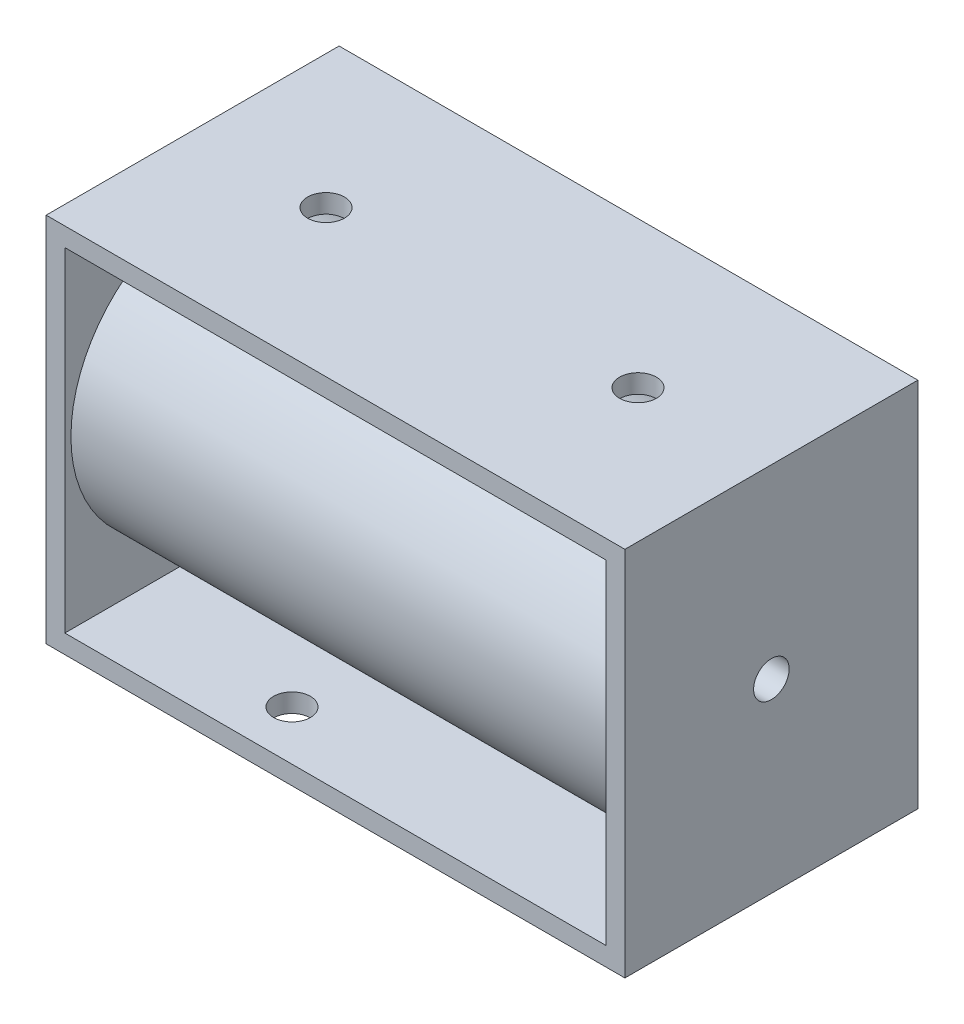
ISO-10303-21;
HEADER;
FILE_DESCRIPTION(('STEP AP214'),'2;1');
FILE_NAME('part.step','',(''),(''),'','','');
FILE_SCHEMA(('AUTOMOTIVE_DESIGN { 1 0 10303 214 1 1 1 1 }'));
ENDSEC;
DATA;
#1=APPLICATION_CONTEXT('core data for automotive mechanical design processes');
#2=APPLICATION_PROTOCOL_DEFINITION('international standard','automotive_design',2000,#1);
#3=PRODUCT_CONTEXT('',#1,'mechanical');
#4=PRODUCT('Part','Part','',(#3));
#5=PRODUCT_RELATED_PRODUCT_CATEGORY('part','',(#4));
#6=PRODUCT_DEFINITION_FORMATION('','',#4);
#7=PRODUCT_DEFINITION_CONTEXT('part definition',#1,'design');
#8=PRODUCT_DEFINITION('design','',#6,#7);
#9=PRODUCT_DEFINITION_SHAPE('','',#8);
#10=(LENGTH_UNIT() NAMED_UNIT(*) SI_UNIT(.MILLI.,.METRE.));
#11=(NAMED_UNIT(*) PLANE_ANGLE_UNIT() SI_UNIT($,.RADIAN.));
#12=(NAMED_UNIT(*) SI_UNIT($,.STERADIAN.) SOLID_ANGLE_UNIT());
#13=UNCERTAINTY_MEASURE_WITH_UNIT(LENGTH_MEASURE(1.E-05),#10,'distance_accuracy_value','');
#14=(GEOMETRIC_REPRESENTATION_CONTEXT(3) GLOBAL_UNCERTAINTY_ASSIGNED_CONTEXT((#13)) GLOBAL_UNIT_ASSIGNED_CONTEXT((#10,
#11,#12)) REPRESENTATION_CONTEXT('',''));
#15=CARTESIAN_POINT('',(0.,0.,0.));
#16=DIRECTION('',(0.,0.,1.));
#17=DIRECTION('',(1.,0.,0.));
#18=AXIS2_PLACEMENT_3D('',#15,#16,#17);
#19=CARTESIAN_POINT('',(0.,15.113,11.9253));
#20=DIRECTION('',(1.,0.,0.));
#21=DIRECTION('',(0.,0.,-1.));
#22=AXIS2_PLACEMENT_3D('',#19,#20,#21);
#23=CYLINDRICAL_SURFACE('',#22,1.4478);
#24=CARTESIAN_POINT('',(47.117,15.113,11.9253));
#25=DIRECTION('',(1.,0.,0.));
#26=DIRECTION('',(0.,0.,-1.));
#27=AXIS2_PLACEMENT_3D('',#24,#25,#26);
#28=CIRCLE('',#27,1.4478);
#29=CARTESIAN_POINT('',(47.117,15.113,10.4775));
#30=VERTEX_POINT('',#29);
#31=EDGE_CURVE('E249',#30,#30,#28,.T.);
#32=ORIENTED_EDGE('',*,*,#31,.T.);
#33=EDGE_LOOP('',(#32));
#34=FACE_BOUND('',#33,.T.);
#35=CARTESIAN_POINT('',(32.1564,15.113,11.9253));
#36=DIRECTION('',(-1.,0.,0.));
#37=DIRECTION('',(0.,0.,1.));
#38=AXIS2_PLACEMENT_3D('',#35,#36,#37);
#39=CIRCLE('',#38,1.4478);
#40=CARTESIAN_POINT('',(32.1564,15.113,13.3731));
#41=VERTEX_POINT('',#40);
#42=EDGE_CURVE('E246',#41,#41,#39,.F.);
#43=ORIENTED_EDGE('',*,*,#42,.F.);
#44=EDGE_LOOP('',(#43));
#45=FACE_BOUND('',#44,.T.);
#46=ADVANCED_FACE('F38',(#34,#45),#23,.F.);
#47=CARTESIAN_POINT('',(45.593,28.702,0.));
#48=DIRECTION('',(1.,0.,0.));
#49=DIRECTION('',(0.,0.,-1.));
#50=AXIS2_PLACEMENT_3D('',#47,#48,#49);
#51=PLANE('',#50);
#52=DIRECTION('',(0.,1.,0.));
#53=VECTOR('',#52,1.);
#54=CARTESIAN_POINT('',(45.593,28.702,23.8506));
#55=LINE('',#54,#53);
#56=CARTESIAN_POINT('',(45.593,1.524,23.8506));
#57=VERTEX_POINT('',#56);
#58=CARTESIAN_POINT('',(45.593,28.702,23.8506));
#59=VERTEX_POINT('',#58);
#60=EDGE_CURVE('E57',#57,#59,#55,.T.);
#61=ORIENTED_EDGE('',*,*,#60,.T.);
#62=DIRECTION('',(0.,0.,1.));
#63=VECTOR('',#62,1.);
#64=CARTESIAN_POINT('',(45.593,28.702,0.));
#65=LINE('',#64,#63);
#66=CARTESIAN_POINT('',(45.593,28.702,0.));
#67=VERTEX_POINT('',#66);
#68=EDGE_CURVE('E118',#67,#59,#65,.T.);
#69=ORIENTED_EDGE('',*,*,#68,.F.);
#70=DIRECTION('',(0.,1.,0.));
#71=VECTOR('',#70,1.);
#72=CARTESIAN_POINT('',(45.593,28.702,0.));
#73=LINE('',#72,#71);
#74=CARTESIAN_POINT('',(45.593,1.524,0.));
#75=VERTEX_POINT('',#74);
#76=EDGE_CURVE('E123',#75,#67,#73,.T.);
#77=ORIENTED_EDGE('',*,*,#76,.F.);
#78=DIRECTION('',(0.,0.,1.));
#79=VECTOR('',#78,1.);
#80=CARTESIAN_POINT('',(45.593,1.524,0.));
#81=LINE('',#80,#79);
#82=EDGE_CURVE('E167',#75,#57,#81,.T.);
#83=ORIENTED_EDGE('',*,*,#82,.T.);
#84=EDGE_LOOP('',(#61,#69,#77,#83));
#85=FACE_BOUND('',#84,.T.);
#86=CARTESIAN_POINT('',(45.593,15.113,11.9253));
#87=DIRECTION('',(1.,0.,0.));
#88=DIRECTION('',(0.,0.,-1.));
#89=AXIS2_PLACEMENT_3D('',#86,#87,#88);
#90=CIRCLE('',#89,11.43);
#91=CARTESIAN_POINT('',(45.593,15.113,0.495300000000001));
#92=VERTEX_POINT('',#91);
#93=EDGE_CURVE('E220',#92,#92,#90,.F.);
#94=ORIENTED_EDGE('',*,*,#93,.F.);
#95=EDGE_LOOP('',(#94));
#96=FACE_BOUND('',#95,.T.);
#97=ADVANCED_FACE('F120',(#85,#96),#51,.F.);
#98=CARTESIAN_POINT('',(1.524,28.702,0.));
#99=DIRECTION('',(-1.,0.,0.));
#100=DIRECTION('',(0.,0.,1.));
#101=AXIS2_PLACEMENT_3D('',#98,#99,#100);
#102=PLANE('',#101);
#103=DIRECTION('',(0.,-1.,0.));
#104=VECTOR('',#103,1.);
#105=CARTESIAN_POINT('',(1.524,28.702,23.8506));
#106=LINE('',#105,#104);
#107=CARTESIAN_POINT('',(1.524,28.702,23.8506));
#108=VERTEX_POINT('',#107);
#109=CARTESIAN_POINT('',(1.524,1.524,23.8506));
#110=VERTEX_POINT('',#109);
#111=EDGE_CURVE('E148',#108,#110,#106,.T.);
#112=ORIENTED_EDGE('',*,*,#111,.T.);
#113=DIRECTION('',(0.,0.,1.));
#114=VECTOR('',#113,1.);
#115=CARTESIAN_POINT('',(1.524,1.524,0.));
#116=LINE('',#115,#114);
#117=CARTESIAN_POINT('',(1.524,1.524,0.));
#118=VERTEX_POINT('',#117);
#119=EDGE_CURVE('E171',#118,#110,#116,.T.);
#120=ORIENTED_EDGE('',*,*,#119,.F.);
#121=DIRECTION('',(0.,-1.,0.));
#122=VECTOR('',#121,1.);
#123=CARTESIAN_POINT('',(1.524,28.702,0.));
#124=LINE('',#123,#122);
#125=CARTESIAN_POINT('',(1.524,28.702,0.));
#126=VERTEX_POINT('',#125);
#127=EDGE_CURVE('E66',#126,#118,#124,.T.);
#128=ORIENTED_EDGE('',*,*,#127,.F.);
#129=DIRECTION('',(0.,0.,1.));
#130=VECTOR('',#129,1.);
#131=CARTESIAN_POINT('',(1.524,28.702,0.));
#132=LINE('',#131,#130);
#133=EDGE_CURVE('E129',#126,#108,#132,.T.);
#134=ORIENTED_EDGE('',*,*,#133,.T.);
#135=EDGE_LOOP('',(#112,#120,#128,#134));
#136=FACE_BOUND('',#135,.T.);
#137=CARTESIAN_POINT('',(1.524,15.113,11.9253));
#138=DIRECTION('',(-1.,0.,0.));
#139=DIRECTION('',(0.,0.,1.));
#140=AXIS2_PLACEMENT_3D('',#137,#138,#139);
#141=CIRCLE('',#140,11.43);
#142=CARTESIAN_POINT('',(1.524,15.113,23.3553));
#143=VERTEX_POINT('',#142);
#144=EDGE_CURVE('E216',#143,#143,#141,.F.);
#145=ORIENTED_EDGE('',*,*,#144,.F.);
#146=EDGE_LOOP('',(#145));
#147=FACE_BOUND('',#146,.T.);
#148=ADVANCED_FACE('F273',(#136,#147),#102,.F.);
#149=CARTESIAN_POINT('',(0.,0.,23.8506));
#150=DIRECTION('',(1.,0.,0.));
#151=DIRECTION('',(0.,0.,-1.));
#152=AXIS2_PLACEMENT_3D('',#149,#150,#151);
#153=PLANE('',#152);
#154=CARTESIAN_POINT('',(0.,15.113,11.9253));
#155=DIRECTION('',(-1.,0.,0.));
#156=DIRECTION('',(0.,0.,1.));
#157=AXIS2_PLACEMENT_3D('',#154,#155,#156);
#158=CIRCLE('',#157,4.1783);
#159=CARTESIAN_POINT('',(0.,15.113,16.1036));
#160=VERTEX_POINT('',#159);
#161=EDGE_CURVE('E250',#160,#160,#158,.T.);
#162=ORIENTED_EDGE('',*,*,#161,.F.);
#163=EDGE_LOOP('',(#162));
#164=FACE_BOUND('',#163,.T.);
#165=DIRECTION('',(0.,-1.,0.));
#166=VECTOR('',#165,1.);
#167=CARTESIAN_POINT('',(0.,0.,0.));
#168=LINE('',#167,#166);
#169=CARTESIAN_POINT('',(0.,30.226,0.));
#170=VERTEX_POINT('',#169);
#171=CARTESIAN_POINT('',(0.,0.,0.));
#172=VERTEX_POINT('',#171);
#173=EDGE_CURVE('E170',#170,#172,#168,.T.);
#174=ORIENTED_EDGE('',*,*,#173,.T.);
#175=DIRECTION('',(0.,0.,-1.));
#176=VECTOR('',#175,1.);
#177=CARTESIAN_POINT('',(0.,0.,23.8506));
#178=LINE('',#177,#176);
#179=CARTESIAN_POINT('',(0.,0.,23.8506));
#180=VERTEX_POINT('',#179);
#181=EDGE_CURVE('E212',#180,#172,#178,.T.);
#182=ORIENTED_EDGE('',*,*,#181,.F.);
#183=DIRECTION('',(0.,-1.,0.));
#184=VECTOR('',#183,1.);
#185=CARTESIAN_POINT('',(0.,0.,23.8506));
#186=LINE('',#185,#184);
#187=CARTESIAN_POINT('',(0.,30.226,23.8506));
#188=VERTEX_POINT('',#187);
#189=EDGE_CURVE('E176',#188,#180,#186,.T.);
#190=ORIENTED_EDGE('',*,*,#189,.F.);
#191=DIRECTION('',(0.,0.,-1.));
#192=VECTOR('',#191,1.);
#193=CARTESIAN_POINT('',(0.,30.226,23.8506));
#194=LINE('',#193,#192);
#195=EDGE_CURVE('E190',#188,#170,#194,.T.);
#196=ORIENTED_EDGE('',*,*,#195,.T.);
#197=EDGE_LOOP('',(#174,#182,#190,#196));
#198=FACE_BOUND('',#197,.T.);
#199=ADVANCED_FACE('F309',(#164,#198),#153,.F.);
#200=CARTESIAN_POINT('',(0.,0.,23.8506));
#201=DIRECTION('',(0.,1.,0.));
#202=DIRECTION('',(0.,0.,1.));
#203=AXIS2_PLACEMENT_3D('',#200,#201,#202);
#204=PLANE('',#203);
#205=CARTESIAN_POINT('',(36.5506,0.,4.0386));
#206=DIRECTION('',(0.,-1.,0.));
#207=DIRECTION('',(0.,0.,-1.));
#208=AXIS2_PLACEMENT_3D('',#205,#206,#207);
#209=CIRCLE('',#208,1.4986);
#210=CARTESIAN_POINT('',(36.5506,0.,2.54));
#211=VERTEX_POINT('',#210);
#212=EDGE_CURVE('E245',#211,#211,#209,.T.);
#213=ORIENTED_EDGE('',*,*,#212,.F.);
#214=EDGE_LOOP('',(#213));
#215=FACE_BOUND('',#214,.T.);
#216=CARTESIAN_POINT('',(10.8585,0.,11.9253));
#217=DIRECTION('',(0.,-1.,0.));
#218=DIRECTION('',(0.,0.,-1.));
#219=AXIS2_PLACEMENT_3D('',#216,#217,#218);
#220=CIRCLE('',#219,1.4986);
#221=CARTESIAN_POINT('',(10.8585,0.,10.4267));
#222=VERTEX_POINT('',#221);
#223=EDGE_CURVE('E240',#222,#222,#220,.T.);
#224=ORIENTED_EDGE('',*,*,#223,.F.);
#225=EDGE_LOOP('',(#224));
#226=FACE_BOUND('',#225,.T.);
#227=CARTESIAN_POINT('',(15.9766,0.,19.812));
#228=DIRECTION('',(0.,-1.,0.));
#229=DIRECTION('',(0.,0.,-1.));
#230=AXIS2_PLACEMENT_3D('',#227,#228,#229);
#231=CIRCLE('',#230,1.4986);
#232=CARTESIAN_POINT('',(15.9766,0.,18.3134));
#233=VERTEX_POINT('',#232);
#234=EDGE_CURVE('E235',#233,#233,#231,.T.);
#235=ORIENTED_EDGE('',*,*,#234,.F.);
#236=EDGE_LOOP('',(#235));
#237=FACE_BOUND('',#236,.T.);
#238=DIRECTION('',(1.,0.,0.));
#239=VECTOR('',#238,1.);
#240=CARTESIAN_POINT('',(0.,0.,0.));
#241=LINE('',#240,#239);
#242=CARTESIAN_POINT('',(47.117,0.,0.));
#243=VERTEX_POINT('',#242);
#244=EDGE_CURVE('E194',#172,#243,#241,.T.);
#245=ORIENTED_EDGE('',*,*,#244,.T.);
#246=DIRECTION('',(0.,0.,-1.));
#247=VECTOR('',#246,1.);
#248=CARTESIAN_POINT('',(47.117,0.,23.8506));
#249=LINE('',#248,#247);
#250=CARTESIAN_POINT('',(47.117,0.,23.8506));
#251=VERTEX_POINT('',#250);
#252=EDGE_CURVE('E208',#251,#243,#249,.T.);
#253=ORIENTED_EDGE('',*,*,#252,.F.);
#254=DIRECTION('',(1.,0.,0.));
#255=VECTOR('',#254,1.);
#256=CARTESIAN_POINT('',(0.,0.,23.8506));
#257=LINE('',#256,#255);
#258=EDGE_CURVE('E180',#180,#251,#257,.T.);
#259=ORIENTED_EDGE('',*,*,#258,.F.);
#260=ORIENTED_EDGE('',*,*,#181,.T.);
#261=EDGE_LOOP('',(#245,#253,#259,#260));
#262=FACE_BOUND('',#261,.T.);
#263=ADVANCED_FACE('F326',(#215,#226,#237,#262),#204,.F.);
#264=CARTESIAN_POINT('',(47.117,0.,23.8506));
#265=DIRECTION('',(-1.,0.,0.));
#266=DIRECTION('',(0.,0.,1.));
#267=AXIS2_PLACEMENT_3D('',#264,#265,#266);
#268=PLANE('',#267);
#269=ORIENTED_EDGE('',*,*,#31,.F.);
#270=EDGE_LOOP('',(#269));
#271=FACE_BOUND('',#270,.T.);
#272=DIRECTION('',(0.,1.,0.));
#273=VECTOR('',#272,1.);
#274=CARTESIAN_POINT('',(47.117,0.,0.));
#275=LINE('',#274,#273);
#276=CARTESIAN_POINT('',(47.117,30.226,0.));
#277=VERTEX_POINT('',#276);
#278=EDGE_CURVE('E197',#243,#277,#275,.T.);
#279=ORIENTED_EDGE('',*,*,#278,.T.);
#280=DIRECTION('',(0.,0.,-1.));
#281=VECTOR('',#280,1.);
#282=CARTESIAN_POINT('',(47.117,30.226,23.8506));
#283=LINE('',#282,#281);
#284=CARTESIAN_POINT('',(47.117,30.226,23.8506));
#285=VERTEX_POINT('',#284);
#286=EDGE_CURVE('E204',#285,#277,#283,.T.);
#287=ORIENTED_EDGE('',*,*,#286,.F.);
#288=DIRECTION('',(0.,1.,0.));
#289=VECTOR('',#288,1.);
#290=CARTESIAN_POINT('',(47.117,0.,23.8506));
#291=LINE('',#290,#289);
#292=EDGE_CURVE('E184',#251,#285,#291,.T.);
#293=ORIENTED_EDGE('',*,*,#292,.F.);
#294=ORIENTED_EDGE('',*,*,#252,.T.);
#295=EDGE_LOOP('',(#279,#287,#293,#294));
#296=FACE_BOUND('',#295,.T.);
#297=ADVANCED_FACE('F322',(#271,#296),#268,.F.);
#298=CARTESIAN_POINT('',(0.,30.226,23.8506));
#299=DIRECTION('',(0.,-1.,0.));
#300=DIRECTION('',(0.,0.,-1.));
#301=AXIS2_PLACEMENT_3D('',#298,#299,#300);
#302=PLANE('',#301);
#303=CARTESIAN_POINT('',(36.2585,30.226,11.9253));
#304=DIRECTION('',(0.,1.,0.));
#305=DIRECTION('',(0.,0.,-1.));
#306=AXIS2_PLACEMENT_3D('',#303,#304,#305);
#307=CIRCLE('',#306,1.4986);
#308=CARTESIAN_POINT('',(36.2585,30.226,10.4267));
#309=VERTEX_POINT('',#308);
#310=EDGE_CURVE('E230',#309,#309,#307,.T.);
#311=ORIENTED_EDGE('',*,*,#310,.F.);
#312=EDGE_LOOP('',(#311));
#313=FACE_BOUND('',#312,.T.);
#314=CARTESIAN_POINT('',(10.8585,30.226,11.9253));
#315=DIRECTION('',(0.,1.,0.));
#316=DIRECTION('',(0.,0.,1.));
#317=AXIS2_PLACEMENT_3D('',#314,#315,#316);
#318=CIRCLE('',#317,1.4986);
#319=CARTESIAN_POINT('',(10.8585,30.226,13.4239));
#320=VERTEX_POINT('',#319);
#321=EDGE_CURVE('E151',#320,#320,#318,.T.);
#322=ORIENTED_EDGE('',*,*,#321,.F.);
#323=EDGE_LOOP('',(#322));
#324=FACE_BOUND('',#323,.T.);
#325=DIRECTION('',(-1.,0.,0.));
#326=VECTOR('',#325,1.);
#327=CARTESIAN_POINT('',(0.,30.226,0.));
#328=LINE('',#327,#326);
#329=EDGE_CURVE('E181',#277,#170,#328,.T.);
#330=ORIENTED_EDGE('',*,*,#329,.T.);
#331=ORIENTED_EDGE('',*,*,#195,.F.);
#332=DIRECTION('',(-1.,0.,0.));
#333=VECTOR('',#332,1.);
#334=CARTESIAN_POINT('',(0.,30.226,23.8506));
#335=LINE('',#334,#333);
#336=EDGE_CURVE('E187',#285,#188,#335,.T.);
#337=ORIENTED_EDGE('',*,*,#336,.F.);
#338=ORIENTED_EDGE('',*,*,#286,.T.);
#339=EDGE_LOOP('',(#330,#331,#337,#338));
#340=FACE_BOUND('',#339,.T.);
#341=ADVANCED_FACE('F316',(#313,#324,#340),#302,.F.);
#342=CARTESIAN_POINT('',(0.,30.226,23.8506));
#343=DIRECTION('',(0.,0.,-1.));
#344=DIRECTION('',(-1.,0.,0.));
#345=AXIS2_PLACEMENT_3D('',#342,#343,#344);
#346=PLANE('',#345);
#347=DIRECTION('',(-1.,0.,0.));
#348=VECTOR('',#347,1.);
#349=CARTESIAN_POINT('',(1.524,28.702,23.8506));
#350=LINE('',#349,#348);
#351=EDGE_CURVE('E160',#59,#108,#350,.T.);
#352=ORIENTED_EDGE('',*,*,#351,.F.);
#353=ORIENTED_EDGE('',*,*,#60,.F.);
#354=DIRECTION('',(1.,0.,0.));
#355=VECTOR('',#354,1.);
#356=CARTESIAN_POINT('',(1.524,1.524,23.8506));
#357=LINE('',#356,#355);
#358=EDGE_CURVE('E142',#110,#57,#357,.T.);
#359=ORIENTED_EDGE('',*,*,#358,.F.);
#360=ORIENTED_EDGE('',*,*,#111,.F.);
#361=EDGE_LOOP('',(#352,#353,#359,#360));
#362=FACE_BOUND('',#361,.T.);
#363=ORIENTED_EDGE('',*,*,#189,.T.);
#364=ORIENTED_EDGE('',*,*,#258,.T.);
#365=ORIENTED_EDGE('',*,*,#292,.T.);
#366=ORIENTED_EDGE('',*,*,#336,.T.);
#367=EDGE_LOOP('',(#363,#364,#365,#366));
#368=FACE_BOUND('',#367,.T.);
#369=ADVANCED_FACE('F313',(#362,#368),#346,.F.);
#370=CARTESIAN_POINT('',(0.,30.226,0.));
#371=DIRECTION('',(0.,0.,-1.));
#372=DIRECTION('',(-1.,0.,0.));
#373=AXIS2_PLACEMENT_3D('',#370,#371,#372);
#374=PLANE('',#373);
#375=ORIENTED_EDGE('',*,*,#76,.T.);
#376=DIRECTION('',(-1.,0.,0.));
#377=VECTOR('',#376,1.);
#378=CARTESIAN_POINT('',(1.524,28.702,0.));
#379=LINE('',#378,#377);
#380=EDGE_CURVE('E133',#67,#126,#379,.T.);
#381=ORIENTED_EDGE('',*,*,#380,.T.);
#382=ORIENTED_EDGE('',*,*,#127,.T.);
#383=DIRECTION('',(1.,0.,0.));
#384=VECTOR('',#383,1.);
#385=CARTESIAN_POINT('',(1.524,1.524,0.));
#386=LINE('',#385,#384);
#387=EDGE_CURVE('E130',#118,#75,#386,.T.);
#388=ORIENTED_EDGE('',*,*,#387,.T.);
#389=EDGE_LOOP('',(#375,#381,#382,#388));
#390=FACE_BOUND('',#389,.T.);
#391=ORIENTED_EDGE('',*,*,#173,.F.);
#392=ORIENTED_EDGE('',*,*,#329,.F.);
#393=ORIENTED_EDGE('',*,*,#278,.F.);
#394=ORIENTED_EDGE('',*,*,#244,.F.);
#395=EDGE_LOOP('',(#391,#392,#393,#394));
#396=FACE_BOUND('',#395,.T.);
#397=ADVANCED_FACE('F138',(#390,#396),#374,.T.);
#398=CARTESIAN_POINT('',(1.524,1.524,0.));
#399=DIRECTION('',(0.,-1.,0.));
#400=DIRECTION('',(0.,0.,-1.));
#401=AXIS2_PLACEMENT_3D('',#398,#399,#400);
#402=PLANE('',#401);
#403=CARTESIAN_POINT('',(36.5506,1.524,4.0386));
#404=DIRECTION('',(0.,-1.,0.));
#405=DIRECTION('',(0.,0.,-1.));
#406=AXIS2_PLACEMENT_3D('',#403,#404,#405);
#407=CIRCLE('',#406,1.4986);
#408=CARTESIAN_POINT('',(36.5506,1.524,2.54));
#409=VERTEX_POINT('',#408);
#410=EDGE_CURVE('E241',#409,#409,#407,.T.);
#411=ORIENTED_EDGE('',*,*,#410,.T.);
#412=EDGE_LOOP('',(#411));
#413=FACE_BOUND('',#412,.T.);
#414=CARTESIAN_POINT('',(10.8585,1.524,11.9253));
#415=DIRECTION('',(0.,-1.,0.));
#416=DIRECTION('',(0.,0.,-1.));
#417=AXIS2_PLACEMENT_3D('',#414,#415,#416);
#418=CIRCLE('',#417,1.4986);
#419=CARTESIAN_POINT('',(10.8585,1.524,10.4267));
#420=VERTEX_POINT('',#419);
#421=EDGE_CURVE('E236',#420,#420,#418,.T.);
#422=ORIENTED_EDGE('',*,*,#421,.T.);
#423=EDGE_LOOP('',(#422));
#424=FACE_BOUND('',#423,.T.);
#425=CARTESIAN_POINT('',(15.9766,1.524,19.812));
#426=DIRECTION('',(0.,-1.,0.));
#427=DIRECTION('',(0.,0.,-1.));
#428=AXIS2_PLACEMENT_3D('',#425,#426,#427);
#429=CIRCLE('',#428,1.4986);
#430=CARTESIAN_POINT('',(15.9766,1.524,18.3134));
#431=VERTEX_POINT('',#430);
#432=EDGE_CURVE('E231',#431,#431,#429,.T.);
#433=ORIENTED_EDGE('',*,*,#432,.T.);
#434=EDGE_LOOP('',(#433));
#435=FACE_BOUND('',#434,.T.);
#436=ORIENTED_EDGE('',*,*,#358,.T.);
#437=ORIENTED_EDGE('',*,*,#82,.F.);
#438=ORIENTED_EDGE('',*,*,#387,.F.);
#439=ORIENTED_EDGE('',*,*,#119,.T.);
#440=EDGE_LOOP('',(#436,#437,#438,#439));
#441=FACE_BOUND('',#440,.T.);
#442=ADVANCED_FACE('F303',(#413,#424,#435,#441),#402,.F.);
#443=CARTESIAN_POINT('',(1.524,28.702,0.));
#444=DIRECTION('',(0.,1.,0.));
#445=DIRECTION('',(0.,0.,1.));
#446=AXIS2_PLACEMENT_3D('',#443,#444,#445);
#447=PLANE('',#446);
#448=CARTESIAN_POINT('',(36.2585,28.702,11.9253));
#449=DIRECTION('',(0.,1.,0.));
#450=DIRECTION('',(0.,0.,1.));
#451=AXIS2_PLACEMENT_3D('',#448,#449,#450);
#452=CIRCLE('',#451,1.4986);
#453=CARTESIAN_POINT('',(36.2585,28.702,13.4239));
#454=VERTEX_POINT('',#453);
#455=EDGE_CURVE('E226',#454,#454,#452,.T.);
#456=ORIENTED_EDGE('',*,*,#455,.T.);
#457=EDGE_LOOP('',(#456));
#458=FACE_BOUND('',#457,.T.);
#459=CARTESIAN_POINT('',(10.8585,28.702,11.9253));
#460=DIRECTION('',(0.,1.,0.));
#461=DIRECTION('',(0.,0.,1.));
#462=AXIS2_PLACEMENT_3D('',#459,#460,#461);
#463=CIRCLE('',#462,1.4986);
#464=CARTESIAN_POINT('',(10.8585,28.702,13.4239));
#465=VERTEX_POINT('',#464);
#466=EDGE_CURVE('E161',#465,#465,#463,.T.);
#467=ORIENTED_EDGE('',*,*,#466,.T.);
#468=EDGE_LOOP('',(#467));
#469=FACE_BOUND('',#468,.T.);
#470=ORIENTED_EDGE('',*,*,#351,.T.);
#471=ORIENTED_EDGE('',*,*,#133,.F.);
#472=ORIENTED_EDGE('',*,*,#380,.F.);
#473=ORIENTED_EDGE('',*,*,#68,.T.);
#474=EDGE_LOOP('',(#470,#471,#472,#473));
#475=FACE_BOUND('',#474,.T.);
#476=ADVANCED_FACE('F134',(#458,#469,#475),#447,.F.);
#477=CARTESIAN_POINT('',(77.921922035849,15.113,11.9253));
#478=DIRECTION('',(-1.,0.,0.));
#479=DIRECTION('',(0.,0.,1.));
#480=AXIS2_PLACEMENT_3D('',#477,#478,#479);
#481=CYLINDRICAL_SURFACE('',#480,11.43);
#482=ORIENTED_EDGE('',*,*,#144,.T.);
#483=EDGE_LOOP('',(#482));
#484=FACE_BOUND('',#483,.T.);
#485=ORIENTED_EDGE('',*,*,#93,.T.);
#486=EDGE_LOOP('',(#485));
#487=FACE_BOUND('',#486,.T.);
#488=ADVANCED_FACE('F298',(#484,#487),#481,.T.);
#489=CARTESIAN_POINT('',(10.8585,27.686,11.9253));
#490=DIRECTION('',(0.,1.,0.));
#491=DIRECTION('',(0.,0.,1.));
#492=AXIS2_PLACEMENT_3D('',#489,#490,#491);
#493=CYLINDRICAL_SURFACE('',#492,1.4986);
#494=ORIENTED_EDGE('',*,*,#321,.T.);
#495=EDGE_LOOP('',(#494));
#496=FACE_BOUND('',#495,.T.);
#497=ORIENTED_EDGE('',*,*,#466,.F.);
#498=EDGE_LOOP('',(#497));
#499=FACE_BOUND('',#498,.T.);
#500=ADVANCED_FACE('F294',(#496,#499),#493,.F.);
#501=CARTESIAN_POINT('',(36.2585,27.686,11.9253));
#502=DIRECTION('',(0.,1.,0.));
#503=DIRECTION('',(0.,0.,1.));
#504=AXIS2_PLACEMENT_3D('',#501,#502,#503);
#505=CYLINDRICAL_SURFACE('',#504,1.4986);
#506=ORIENTED_EDGE('',*,*,#310,.T.);
#507=EDGE_LOOP('',(#506));
#508=FACE_BOUND('',#507,.T.);
#509=ORIENTED_EDGE('',*,*,#455,.F.);
#510=EDGE_LOOP('',(#509));
#511=FACE_BOUND('',#510,.T.);
#512=ADVANCED_FACE('F290',(#508,#511),#505,.F.);
#513=CARTESIAN_POINT('',(15.9766,2.54,19.812));
#514=DIRECTION('',(0.,-1.,0.));
#515=DIRECTION('',(0.,0.,-1.));
#516=AXIS2_PLACEMENT_3D('',#513,#514,#515);
#517=CYLINDRICAL_SURFACE('',#516,1.4986);
#518=ORIENTED_EDGE('',*,*,#234,.T.);
#519=EDGE_LOOP('',(#518));
#520=FACE_BOUND('',#519,.T.);
#521=ORIENTED_EDGE('',*,*,#432,.F.);
#522=EDGE_LOOP('',(#521));
#523=FACE_BOUND('',#522,.T.);
#524=ADVANCED_FACE('F286',(#520,#523),#517,.F.);
#525=CARTESIAN_POINT('',(10.8585,2.54,11.9253));
#526=DIRECTION('',(0.,-1.,0.));
#527=DIRECTION('',(0.,0.,-1.));
#528=AXIS2_PLACEMENT_3D('',#525,#526,#527);
#529=CYLINDRICAL_SURFACE('',#528,1.4986);
#530=ORIENTED_EDGE('',*,*,#223,.T.);
#531=EDGE_LOOP('',(#530));
#532=FACE_BOUND('',#531,.T.);
#533=ORIENTED_EDGE('',*,*,#421,.F.);
#534=EDGE_LOOP('',(#533));
#535=FACE_BOUND('',#534,.T.);
#536=ADVANCED_FACE('F282',(#532,#535),#529,.F.);
#537=CARTESIAN_POINT('',(36.5506,2.54,4.0386));
#538=DIRECTION('',(0.,-1.,0.));
#539=DIRECTION('',(0.,0.,-1.));
#540=AXIS2_PLACEMENT_3D('',#537,#538,#539);
#541=CYLINDRICAL_SURFACE('',#540,1.4986);
#542=ORIENTED_EDGE('',*,*,#212,.T.);
#543=EDGE_LOOP('',(#542));
#544=FACE_BOUND('',#543,.T.);
#545=ORIENTED_EDGE('',*,*,#410,.F.);
#546=EDGE_LOOP('',(#545));
#547=FACE_BOUND('',#546,.T.);
#548=ADVANCED_FACE('F279',(#544,#547),#541,.F.);
#549=CARTESIAN_POINT('',(32.1564,15.113,11.9253));
#550=DIRECTION('',(-1.,0.,0.));
#551=DIRECTION('',(0.,0.,1.));
#552=AXIS2_PLACEMENT_3D('',#549,#550,#551);
#553=PLANE('',#552);
#554=CARTESIAN_POINT('',(32.1564,15.113,11.9253));
#555=DIRECTION('',(-1.,0.,0.));
#556=DIRECTION('',(0.,0.,1.));
#557=AXIS2_PLACEMENT_3D('',#554,#555,#556);
#558=CIRCLE('',#557,1.83194850601334);
#559=CARTESIAN_POINT('',(32.1564,15.113,13.7572485060133));
#560=VERTEX_POINT('',#559);
#561=EDGE_CURVE('E47',#560,#560,#558,.T.);
#562=ORIENTED_EDGE('',*,*,#561,.T.);
#563=EDGE_LOOP('',(#562));
#564=FACE_BOUND('',#563,.T.);
#565=ORIENTED_EDGE('',*,*,#42,.T.);
#566=EDGE_LOOP('',(#565));
#567=FACE_BOUND('',#566,.T.);
#568=ADVANCED_FACE('F255',(#564,#567),#553,.T.);
#569=CARTESIAN_POINT('',(32.1564,15.113,11.9253));
#570=DIRECTION('',(-1.,0.,0.));
#571=DIRECTION('',(0.,0.,1.));
#572=AXIS2_PLACEMENT_3D('',#569,#570,#571);
#573=CYLINDRICAL_SURFACE('',#572,4.1783);
#574=CARTESIAN_POINT('',(28.0924,15.113,11.9253));
#575=DIRECTION('',(-1.,0.,0.));
#576=DIRECTION('',(0.,0.,1.));
#577=AXIS2_PLACEMENT_3D('',#574,#575,#576);
#578=CIRCLE('',#577,4.1783);
#579=CARTESIAN_POINT('',(28.0924,15.113,16.1036));
#580=VERTEX_POINT('',#579);
#581=EDGE_CURVE('E11',#580,#580,#578,.F.);
#582=ORIENTED_EDGE('',*,*,#581,.T.);
#583=EDGE_LOOP('',(#582));
#584=FACE_BOUND('',#583,.T.);
#585=ORIENTED_EDGE('',*,*,#161,.T.);
#586=EDGE_LOOP('',(#585));
#587=FACE_BOUND('',#586,.T.);
#588=ADVANCED_FACE('F259',(#584,#587),#573,.F.);
#589=CARTESIAN_POINT('',(32.1564,15.113,11.9253));
#590=DIRECTION('',(-1.,0.,0.));
#591=DIRECTION('',(0.,0.,1.));
#592=AXIS2_PLACEMENT_3D('',#589,#590,#591);
#593=CONICAL_SURFACE('',#592,1.83194850601334,0.523598775598304);
#594=ORIENTED_EDGE('',*,*,#581,.F.);
#595=EDGE_LOOP('',(#594));
#596=FACE_BOUND('',#595,.T.);
#597=ORIENTED_EDGE('',*,*,#561,.F.);
#598=EDGE_LOOP('',(#597));
#599=FACE_BOUND('',#598,.T.);
#600=ADVANCED_FACE('F40',(#596,#599),#593,.F.);
#601=CLOSED_SHELL('',(#46,#97,#148,#199,#263,#297,#341,#369,#397,#442,#476,#488,#500,#512,#524,
#536,#548,#568,#588,#600));
#602=MANIFOLD_SOLID_BREP('B2',#601);
#603=ADVANCED_BREP_SHAPE_REPRESENTATION('',(#18,#602),#14);
#604=SHAPE_DEFINITION_REPRESENTATION(#9,#603);
ENDSEC;
END-ISO-10303-21;
